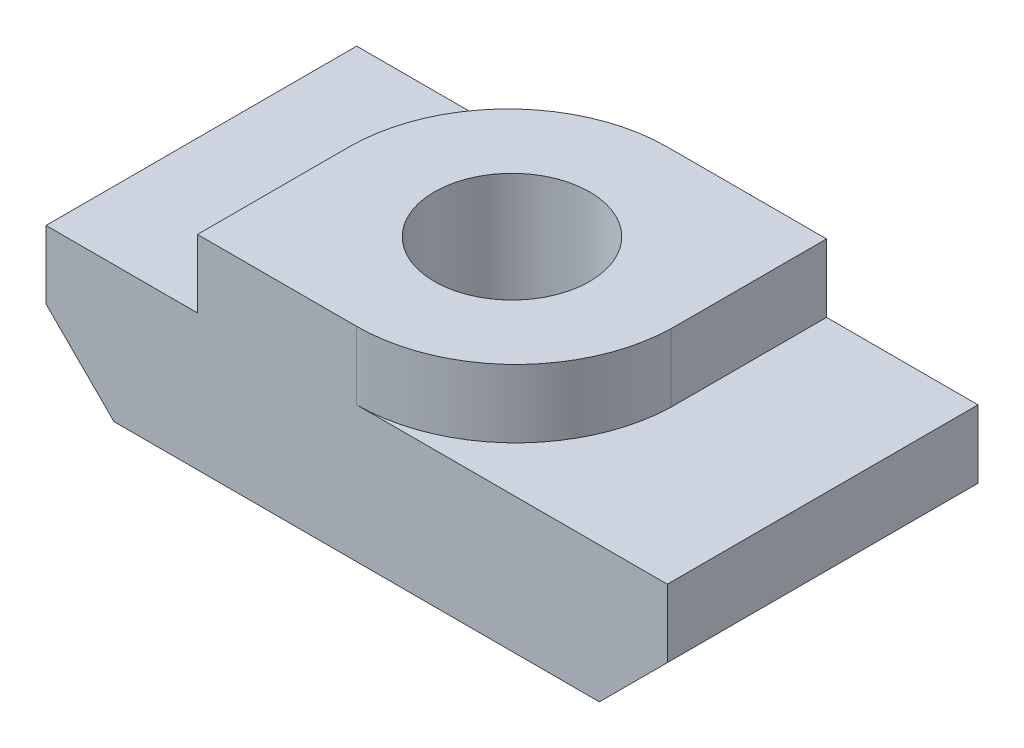
ISO-10303-21;
HEADER;
FILE_DESCRIPTION(('STEP AP214'),'2;1');
FILE_NAME('part.step','',(''),(''),'','','');
FILE_SCHEMA(('AUTOMOTIVE_DESIGN { 1 0 10303 214 1 1 1 1 }'));
ENDSEC;
DATA;
#1=APPLICATION_CONTEXT('core data for automotive mechanical design processes');
#2=APPLICATION_PROTOCOL_DEFINITION('international standard','automotive_design',2000,#1);
#3=PRODUCT_CONTEXT('',#1,'mechanical');
#4=PRODUCT('Part','Part','',(#3));
#5=PRODUCT_RELATED_PRODUCT_CATEGORY('part','',(#4));
#6=PRODUCT_DEFINITION_FORMATION('','',#4);
#7=PRODUCT_DEFINITION_CONTEXT('part definition',#1,'design');
#8=PRODUCT_DEFINITION('design','',#6,#7);
#9=PRODUCT_DEFINITION_SHAPE('','',#8);
#10=(LENGTH_UNIT() NAMED_UNIT(*) SI_UNIT(.MILLI.,.METRE.));
#11=(NAMED_UNIT(*) PLANE_ANGLE_UNIT() SI_UNIT($,.RADIAN.));
#12=(NAMED_UNIT(*) SI_UNIT($,.STERADIAN.) SOLID_ANGLE_UNIT());
#13=UNCERTAINTY_MEASURE_WITH_UNIT(LENGTH_MEASURE(1.E-05),#10,'distance_accuracy_value','');
#14=(GEOMETRIC_REPRESENTATION_CONTEXT(3) GLOBAL_UNCERTAINTY_ASSIGNED_CONTEXT((#13)) GLOBAL_UNIT_ASSIGNED_CONTEXT((#10,
#11,#12)) REPRESENTATION_CONTEXT('',''));
#15=CARTESIAN_POINT('',(0.,0.,0.));
#16=DIRECTION('',(0.,0.,1.));
#17=DIRECTION('',(1.,0.,0.));
#18=AXIS2_PLACEMENT_3D('',#15,#16,#17);
#19=CARTESIAN_POINT('',(4.1,5.25,8.));
#20=DIRECTION('',(0.,-1.,0.));
#21=DIRECTION('',(0.,0.,-1.));
#22=AXIS2_PLACEMENT_3D('',#19,#20,#21);
#23=PLANE('',#22);
#24=CARTESIAN_POINT('',(0.,5.25,4.));
#25=DIRECTION('',(0.,1.,0.));
#26=DIRECTION('',(0.,0.,1.));
#27=AXIS2_PLACEMENT_3D('',#24,#25,#26);
#28=CIRCLE('',#27,2.);
#29=CARTESIAN_POINT('',(0.,5.25,6.));
#30=VERTEX_POINT('',#29);
#31=EDGE_CURVE('E168',#30,#30,#28,.T.);
#32=ORIENTED_EDGE('',*,*,#31,.F.);
#33=EDGE_LOOP('',(#32));
#34=FACE_BOUND('',#33,.T.);
#35=CARTESIAN_POINT('',(0.,5.25,4.1));
#36=DIRECTION('',(0.,1.,0.));
#37=DIRECTION('',(0.,0.,1.));
#38=AXIS2_PLACEMENT_3D('',#35,#36,#37);
#39=CIRCLE('',#38,4.1);
#40=CARTESIAN_POINT('',(0.,5.25,0.));
#41=VERTEX_POINT('',#40);
#42=CARTESIAN_POINT('',(-4.1,5.25,4.1));
#43=VERTEX_POINT('',#42);
#44=EDGE_CURVE('E149',#41,#43,#39,.T.);
#45=ORIENTED_EDGE('',*,*,#44,.T.);
#46=DIRECTION('',(0.,0.,-1.));
#47=VECTOR('',#46,1.);
#48=CARTESIAN_POINT('',(-4.1,5.25,8.));
#49=LINE('',#48,#47);
#50=CARTESIAN_POINT('',(-4.1,5.25,8.));
#51=VERTEX_POINT('',#50);
#52=EDGE_CURVE('E182',#51,#43,#49,.T.);
#53=ORIENTED_EDGE('',*,*,#52,.F.);
#54=DIRECTION('',(-1.,0.,0.));
#55=VECTOR('',#54,1.);
#56=CARTESIAN_POINT('',(4.1,5.25,8.));
#57=LINE('',#56,#55);
#58=CARTESIAN_POINT('',(0.,5.25,8.));
#59=VERTEX_POINT('',#58);
#60=EDGE_CURVE('E198',#59,#51,#57,.T.);
#61=ORIENTED_EDGE('',*,*,#60,.F.);
#62=CARTESIAN_POINT('',(0.,5.25,3.89875));
#63=DIRECTION('',(0.,1.,0.));
#64=DIRECTION('',(0.,0.,1.));
#65=AXIS2_PLACEMENT_3D('',#62,#63,#64);
#66=CIRCLE('',#65,4.10125);
#67=CARTESIAN_POINT('',(4.1,5.25,4.00000000000001));
#68=VERTEX_POINT('',#67);
#69=EDGE_CURVE('E160',#59,#68,#66,.T.);
#70=ORIENTED_EDGE('',*,*,#69,.T.);
#71=DIRECTION('',(0.,0.,-1.));
#72=VECTOR('',#71,1.);
#73=CARTESIAN_POINT('',(4.1,5.25,8.));
#74=LINE('',#73,#72);
#75=CARTESIAN_POINT('',(4.1,5.25,0.));
#76=VERTEX_POINT('',#75);
#77=EDGE_CURVE('E78',#68,#76,#74,.T.);
#78=ORIENTED_EDGE('',*,*,#77,.T.);
#79=DIRECTION('',(-1.,0.,0.));
#80=VECTOR('',#79,1.);
#81=CARTESIAN_POINT('',(4.1,5.25,0.));
#82=LINE('',#81,#80);
#83=EDGE_CURVE('E197',#76,#41,#82,.T.);
#84=ORIENTED_EDGE('',*,*,#83,.T.);
#85=EDGE_LOOP('',(#45,#53,#61,#70,#78,#84));
#86=FACE_BOUND('',#85,.T.);
#87=ADVANCED_FACE('F33',(#34,#86),#23,.F.);
#88=CARTESIAN_POINT('',(-4.1,3.5,8.));
#89=DIRECTION('',(1.,0.,0.));
#90=DIRECTION('',(0.,-1.,0.));
#91=AXIS2_PLACEMENT_3D('',#88,#89,#90);
#92=PLANE('',#91);
#93=DIRECTION('',(0.,1.,0.));
#94=VECTOR('',#93,1.);
#95=CARTESIAN_POINT('',(-4.1,3.5,4.1));
#96=LINE('',#95,#94);
#97=CARTESIAN_POINT('',(-4.1,3.5,4.1));
#98=VERTEX_POINT('',#97);
#99=EDGE_CURVE('E150',#98,#43,#96,.T.);
#100=ORIENTED_EDGE('',*,*,#99,.F.);
#101=DIRECTION('',(0.,0.,-1.));
#102=VECTOR('',#101,1.);
#103=CARTESIAN_POINT('',(-4.1,3.5,8.));
#104=LINE('',#103,#102);
#105=CARTESIAN_POINT('',(-4.1,3.5,8.));
#106=VERTEX_POINT('',#105);
#107=EDGE_CURVE('E156',#106,#98,#104,.T.);
#108=ORIENTED_EDGE('',*,*,#107,.F.);
#109=DIRECTION('',(0.,1.,0.));
#110=VECTOR('',#109,1.);
#111=CARTESIAN_POINT('',(-4.1,3.5,8.));
#112=LINE('',#111,#110);
#113=EDGE_CURVE('E179',#106,#51,#112,.T.);
#114=ORIENTED_EDGE('',*,*,#113,.T.);
#115=ORIENTED_EDGE('',*,*,#52,.T.);
#116=EDGE_LOOP('',(#100,#108,#114,#115));
#117=FACE_BOUND('',#116,.T.);
#118=ADVANCED_FACE('F244',(#117),#92,.F.);
#119=CARTESIAN_POINT('',(4.1,3.5,8.));
#120=DIRECTION('',(-1.,0.,0.));
#121=DIRECTION('',(0.,-1.,0.));
#122=AXIS2_PLACEMENT_3D('',#119,#120,#121);
#123=PLANE('',#122);
#124=DIRECTION('',(0.,1.,0.));
#125=VECTOR('',#124,1.);
#126=CARTESIAN_POINT('',(4.1,3.5,4.00000000000001));
#127=LINE('',#126,#125);
#128=CARTESIAN_POINT('',(4.1,3.5,4.00000000000001));
#129=VERTEX_POINT('',#128);
#130=EDGE_CURVE('E166',#129,#68,#127,.T.);
#131=ORIENTED_EDGE('',*,*,#130,.F.);
#132=DIRECTION('',(0.,0.,-1.));
#133=VECTOR('',#132,1.);
#134=CARTESIAN_POINT('',(4.1,3.5,8.));
#135=LINE('',#134,#133);
#136=CARTESIAN_POINT('',(4.1,3.5,0.));
#137=VERTEX_POINT('',#136);
#138=EDGE_CURVE('E218',#129,#137,#135,.T.);
#139=ORIENTED_EDGE('',*,*,#138,.T.);
#140=DIRECTION('',(0.,1.,0.));
#141=VECTOR('',#140,1.);
#142=CARTESIAN_POINT('',(4.1,3.5,0.));
#143=LINE('',#142,#141);
#144=EDGE_CURVE('E200',#137,#76,#143,.T.);
#145=ORIENTED_EDGE('',*,*,#144,.T.);
#146=ORIENTED_EDGE('',*,*,#77,.F.);
#147=EDGE_LOOP('',(#131,#139,#145,#146));
#148=FACE_BOUND('',#147,.T.);
#149=ADVANCED_FACE('F268',(#148),#123,.F.);
#150=CARTESIAN_POINT('',(0.,0.,8.));
#151=DIRECTION('',(0.,0.,1.));
#152=DIRECTION('',(1.,0.,0.));
#153=AXIS2_PLACEMENT_3D('',#150,#151,#152);
#154=PLANE('',#153);
#155=DIRECTION('',(-1.,0.,0.));
#156=VECTOR('',#155,1.);
#157=CARTESIAN_POINT('',(8.,3.5,8.));
#158=LINE('',#157,#156);
#159=CARTESIAN_POINT('',(8.,3.5,8.));
#160=VERTEX_POINT('',#159);
#161=CARTESIAN_POINT('',(0.,3.5,8.));
#162=VERTEX_POINT('',#161);
#163=EDGE_CURVE('E48',#160,#162,#158,.T.);
#164=ORIENTED_EDGE('',*,*,#163,.T.);
#165=DIRECTION('',(0.,1.,0.));
#166=VECTOR('',#165,1.);
#167=CARTESIAN_POINT('',(0.,3.5,8.));
#168=LINE('',#167,#166);
#169=EDGE_CURVE('E164',#162,#59,#168,.T.);
#170=ORIENTED_EDGE('',*,*,#169,.T.);
#171=ORIENTED_EDGE('',*,*,#60,.T.);
#172=ORIENTED_EDGE('',*,*,#113,.F.);
#173=DIRECTION('',(1.,0.,0.));
#174=VECTOR('',#173,1.);
#175=CARTESIAN_POINT('',(-8.,3.5,8.));
#176=LINE('',#175,#174);
#177=CARTESIAN_POINT('',(-8.,3.5,8.));
#178=VERTEX_POINT('',#177);
#179=EDGE_CURVE('E177',#178,#106,#176,.T.);
#180=ORIENTED_EDGE('',*,*,#179,.F.);
#181=DIRECTION('',(0.,1.,0.));
#182=VECTOR('',#181,1.);
#183=CARTESIAN_POINT('',(-8.,1.75,8.));
#184=LINE('',#183,#182);
#185=CARTESIAN_POINT('',(-8.,1.75,8.));
#186=VERTEX_POINT('',#185);
#187=EDGE_CURVE('E174',#186,#178,#184,.T.);
#188=ORIENTED_EDGE('',*,*,#187,.F.);
#189=DIRECTION('',(-0.707106781186551,0.707106781186544,0.));
#190=VECTOR('',#189,1.);
#191=CARTESIAN_POINT('',(-6.24999999999998,0.,8.));
#192=LINE('',#191,#190);
#193=CARTESIAN_POINT('',(-6.24999999999998,0.,8.));
#194=VERTEX_POINT('',#193);
#195=EDGE_CURVE('E142',#194,#186,#192,.T.);
#196=ORIENTED_EDGE('',*,*,#195,.F.);
#197=DIRECTION('',(1.,0.,0.));
#198=VECTOR('',#197,1.);
#199=CARTESIAN_POINT('',(0.,0.,8.));
#200=LINE('',#199,#198);
#201=CARTESIAN_POINT('',(6.24999999999998,0.,8.));
#202=VERTEX_POINT('',#201);
#203=EDGE_CURVE('E83',#194,#202,#200,.T.);
#204=ORIENTED_EDGE('',*,*,#203,.T.);
#205=DIRECTION('',(0.707106781186551,0.707106781186544,0.));
#206=VECTOR('',#205,1.);
#207=CARTESIAN_POINT('',(6.24999999999998,0.,8.));
#208=LINE('',#207,#206);
#209=CARTESIAN_POINT('',(8.,1.75,8.));
#210=VERTEX_POINT('',#209);
#211=EDGE_CURVE('E202',#202,#210,#208,.T.);
#212=ORIENTED_EDGE('',*,*,#211,.T.);
#213=DIRECTION('',(0.,1.,0.));
#214=VECTOR('',#213,1.);
#215=CARTESIAN_POINT('',(8.,1.75,8.));
#216=LINE('',#215,#214);
#217=EDGE_CURVE('E54',#210,#160,#216,.T.);
#218=ORIENTED_EDGE('',*,*,#217,.T.);
#219=EDGE_LOOP('',(#164,#170,#171,#172,#180,#188,#196,#204,#212,#218));
#220=FACE_BOUND('',#219,.T.);
#221=ADVANCED_FACE('F241',(#220),#154,.T.);
#222=CARTESIAN_POINT('',(0.,0.,8.));
#223=DIRECTION('',(0.,1.,0.));
#224=DIRECTION('',(0.,0.,1.));
#225=AXIS2_PLACEMENT_3D('',#222,#223,#224);
#226=PLANE('',#225);
#227=CARTESIAN_POINT('',(0.,0.,4.));
#228=DIRECTION('',(0.,1.,0.));
#229=DIRECTION('',(0.,0.,1.));
#230=AXIS2_PLACEMENT_3D('',#227,#228,#229);
#231=CIRCLE('',#230,2.);
#232=CARTESIAN_POINT('',(0.,0.,6.));
#233=VERTEX_POINT('',#232);
#234=EDGE_CURVE('E36',#233,#233,#231,.T.);
#235=ORIENTED_EDGE('',*,*,#234,.T.);
#236=EDGE_LOOP('',(#235));
#237=FACE_BOUND('',#236,.T.);
#238=DIRECTION('',(1.,0.,0.));
#239=VECTOR('',#238,1.);
#240=CARTESIAN_POINT('',(0.,0.,0.));
#241=LINE('',#240,#239);
#242=CARTESIAN_POINT('',(-6.24999999999998,0.,0.));
#243=VERTEX_POINT('',#242);
#244=CARTESIAN_POINT('',(6.24999999999998,0.,0.));
#245=VERTEX_POINT('',#244);
#246=EDGE_CURVE('E207',#243,#245,#241,.T.);
#247=ORIENTED_EDGE('',*,*,#246,.T.);
#248=DIRECTION('',(0.,0.,-1.));
#249=VECTOR('',#248,1.);
#250=CARTESIAN_POINT('',(6.24999999999998,0.,8.));
#251=LINE('',#250,#249);
#252=EDGE_CURVE('E11',#202,#245,#251,.T.);
#253=ORIENTED_EDGE('',*,*,#252,.F.);
#254=ORIENTED_EDGE('',*,*,#203,.F.);
#255=DIRECTION('',(0.,0.,-1.));
#256=VECTOR('',#255,1.);
#257=CARTESIAN_POINT('',(-6.24999999999998,0.,8.));
#258=LINE('',#257,#256);
#259=EDGE_CURVE('E194',#194,#243,#258,.T.);
#260=ORIENTED_EDGE('',*,*,#259,.T.);
#261=EDGE_LOOP('',(#247,#253,#254,#260));
#262=FACE_BOUND('',#261,.T.);
#263=ADVANCED_FACE('F253',(#237,#262),#226,.F.);
#264=CARTESIAN_POINT('',(6.24999999999998,0.,8.));
#265=DIRECTION('',(-0.707106781186544,0.707106781186551,0.));
#266=DIRECTION('',(-0.707106781186551,-0.707106781186544,0.));
#267=AXIS2_PLACEMENT_3D('',#264,#265,#266);
#268=PLANE('',#267);
#269=DIRECTION('',(0.707106781186551,0.707106781186544,0.));
#270=VECTOR('',#269,1.);
#271=CARTESIAN_POINT('',(6.24999999999998,0.,0.));
#272=LINE('',#271,#270);
#273=CARTESIAN_POINT('',(8.,1.75,0.));
#274=VERTEX_POINT('',#273);
#275=EDGE_CURVE('E209',#245,#274,#272,.T.);
#276=ORIENTED_EDGE('',*,*,#275,.T.);
#277=DIRECTION('',(0.,0.,-1.));
#278=VECTOR('',#277,1.);
#279=CARTESIAN_POINT('',(8.,1.75,8.));
#280=LINE('',#279,#278);
#281=EDGE_CURVE('E41',#210,#274,#280,.T.);
#282=ORIENTED_EDGE('',*,*,#281,.F.);
#283=ORIENTED_EDGE('',*,*,#211,.F.);
#284=ORIENTED_EDGE('',*,*,#252,.T.);
#285=EDGE_LOOP('',(#276,#282,#283,#284));
#286=FACE_BOUND('',#285,.T.);
#287=ADVANCED_FACE('F254',(#286),#268,.F.);
#288=CARTESIAN_POINT('',(8.,1.75,8.));
#289=DIRECTION('',(-1.,0.,0.));
#290=DIRECTION('',(0.,-1.,0.));
#291=AXIS2_PLACEMENT_3D('',#288,#289,#290);
#292=PLANE('',#291);
#293=DIRECTION('',(0.,1.,0.));
#294=VECTOR('',#293,1.);
#295=CARTESIAN_POINT('',(8.,1.75,0.));
#296=LINE('',#295,#294);
#297=CARTESIAN_POINT('',(8.,3.5,0.));
#298=VERTEX_POINT('',#297);
#299=EDGE_CURVE('E211',#274,#298,#296,.T.);
#300=ORIENTED_EDGE('',*,*,#299,.T.);
#301=DIRECTION('',(0.,0.,-1.));
#302=VECTOR('',#301,1.);
#303=CARTESIAN_POINT('',(8.,3.5,8.));
#304=LINE('',#303,#302);
#305=EDGE_CURVE('E220',#160,#298,#304,.T.);
#306=ORIENTED_EDGE('',*,*,#305,.F.);
#307=ORIENTED_EDGE('',*,*,#217,.F.);
#308=ORIENTED_EDGE('',*,*,#281,.T.);
#309=EDGE_LOOP('',(#300,#306,#307,#308));
#310=FACE_BOUND('',#309,.T.);
#311=ADVANCED_FACE('F227',(#310),#292,.F.);
#312=CARTESIAN_POINT('',(8.,3.5,8.));
#313=DIRECTION('',(0.,-1.,0.));
#314=DIRECTION('',(1.,0.,0.));
#315=AXIS2_PLACEMENT_3D('',#312,#313,#314);
#316=PLANE('',#315);
#317=DIRECTION('',(-1.,0.,0.));
#318=VECTOR('',#317,1.);
#319=CARTESIAN_POINT('',(8.,3.5,0.));
#320=LINE('',#319,#318);
#321=EDGE_CURVE('E213',#298,#137,#320,.T.);
#322=ORIENTED_EDGE('',*,*,#321,.T.);
#323=ORIENTED_EDGE('',*,*,#138,.F.);
#324=CARTESIAN_POINT('',(0.,3.5,3.89875));
#325=DIRECTION('',(0.,1.,0.));
#326=DIRECTION('',(0.,0.,1.));
#327=AXIS2_PLACEMENT_3D('',#324,#325,#326);
#328=CIRCLE('',#327,4.10125);
#329=EDGE_CURVE('E162',#162,#129,#328,.T.);
#330=ORIENTED_EDGE('',*,*,#329,.F.);
#331=ORIENTED_EDGE('',*,*,#163,.F.);
#332=ORIENTED_EDGE('',*,*,#305,.T.);
#333=EDGE_LOOP('',(#322,#323,#330,#331,#332));
#334=FACE_BOUND('',#333,.T.);
#335=ADVANCED_FACE('F235',(#334),#316,.F.);
#336=CARTESIAN_POINT('',(0.,0.,0.));
#337=DIRECTION('',(0.,0.,1.));
#338=DIRECTION('',(1.,0.,0.));
#339=AXIS2_PLACEMENT_3D('',#336,#337,#338);
#340=PLANE('',#339);
#341=DIRECTION('',(1.,0.,0.));
#342=VECTOR('',#341,1.);
#343=CARTESIAN_POINT('',(-8.,3.5,0.));
#344=LINE('',#343,#342);
#345=CARTESIAN_POINT('',(-8.,3.5,0.));
#346=VERTEX_POINT('',#345);
#347=CARTESIAN_POINT('',(0.,3.5,0.));
#348=VERTEX_POINT('',#347);
#349=EDGE_CURVE('E131',#346,#348,#344,.T.);
#350=ORIENTED_EDGE('',*,*,#349,.T.);
#351=DIRECTION('',(0.,1.,0.));
#352=VECTOR('',#351,1.);
#353=CARTESIAN_POINT('',(0.,3.5,0.));
#354=LINE('',#353,#352);
#355=EDGE_CURVE('E135',#348,#41,#354,.T.);
#356=ORIENTED_EDGE('',*,*,#355,.T.);
#357=ORIENTED_EDGE('',*,*,#83,.F.);
#358=ORIENTED_EDGE('',*,*,#144,.F.);
#359=ORIENTED_EDGE('',*,*,#321,.F.);
#360=ORIENTED_EDGE('',*,*,#299,.F.);
#361=ORIENTED_EDGE('',*,*,#275,.F.);
#362=ORIENTED_EDGE('',*,*,#246,.F.);
#363=DIRECTION('',(-0.707106781186551,0.707106781186544,0.));
#364=VECTOR('',#363,1.);
#365=CARTESIAN_POINT('',(-6.24999999999998,0.,0.));
#366=LINE('',#365,#364);
#367=CARTESIAN_POINT('',(-8.,1.75,0.));
#368=VERTEX_POINT('',#367);
#369=EDGE_CURVE('E183',#243,#368,#366,.T.);
#370=ORIENTED_EDGE('',*,*,#369,.T.);
#371=DIRECTION('',(0.,1.,0.));
#372=VECTOR('',#371,1.);
#373=CARTESIAN_POINT('',(-8.,1.75,0.));
#374=LINE('',#373,#372);
#375=EDGE_CURVE('E137',#368,#346,#374,.T.);
#376=ORIENTED_EDGE('',*,*,#375,.T.);
#377=EDGE_LOOP('',(#350,#356,#357,#358,#359,#360,#361,#362,#370,#376));
#378=FACE_BOUND('',#377,.T.);
#379=ADVANCED_FACE('F133',(#378),#340,.F.);
#380=CARTESIAN_POINT('',(-6.24999999999998,0.,8.));
#381=DIRECTION('',(0.707106781186544,0.707106781186551,0.));
#382=DIRECTION('',(0.707106781186551,-0.707106781186544,0.));
#383=AXIS2_PLACEMENT_3D('',#380,#381,#382);
#384=PLANE('',#383);
#385=ORIENTED_EDGE('',*,*,#369,.F.);
#386=ORIENTED_EDGE('',*,*,#259,.F.);
#387=ORIENTED_EDGE('',*,*,#195,.T.);
#388=DIRECTION('',(0.,0.,-1.));
#389=VECTOR('',#388,1.);
#390=CARTESIAN_POINT('',(-8.,1.75,8.));
#391=LINE('',#390,#389);
#392=EDGE_CURVE('E191',#186,#368,#391,.T.);
#393=ORIENTED_EDGE('',*,*,#392,.T.);
#394=EDGE_LOOP('',(#385,#386,#387,#393));
#395=FACE_BOUND('',#394,.T.);
#396=ADVANCED_FACE('F251',(#395),#384,.F.);
#397=CARTESIAN_POINT('',(-8.,1.75,8.));
#398=DIRECTION('',(1.,0.,0.));
#399=DIRECTION('',(0.,-1.,0.));
#400=AXIS2_PLACEMENT_3D('',#397,#398,#399);
#401=PLANE('',#400);
#402=ORIENTED_EDGE('',*,*,#375,.F.);
#403=ORIENTED_EDGE('',*,*,#392,.F.);
#404=ORIENTED_EDGE('',*,*,#187,.T.);
#405=DIRECTION('',(0.,0.,-1.));
#406=VECTOR('',#405,1.);
#407=CARTESIAN_POINT('',(-8.,3.5,8.));
#408=LINE('',#407,#406);
#409=EDGE_CURVE('E189',#178,#346,#408,.T.);
#410=ORIENTED_EDGE('',*,*,#409,.T.);
#411=EDGE_LOOP('',(#402,#403,#404,#410));
#412=FACE_BOUND('',#411,.T.);
#413=ADVANCED_FACE('F247',(#412),#401,.F.);
#414=CARTESIAN_POINT('',(-8.,3.5,8.));
#415=DIRECTION('',(0.,-1.,0.));
#416=DIRECTION('',(-1.,0.,0.));
#417=AXIS2_PLACEMENT_3D('',#414,#415,#416);
#418=PLANE('',#417);
#419=ORIENTED_EDGE('',*,*,#349,.F.);
#420=ORIENTED_EDGE('',*,*,#409,.F.);
#421=ORIENTED_EDGE('',*,*,#179,.T.);
#422=ORIENTED_EDGE('',*,*,#107,.T.);
#423=CARTESIAN_POINT('',(0.,3.5,4.1));
#424=DIRECTION('',(0.,1.,0.));
#425=DIRECTION('',(0.,0.,1.));
#426=AXIS2_PLACEMENT_3D('',#423,#424,#425);
#427=CIRCLE('',#426,4.1);
#428=EDGE_CURVE('E146',#348,#98,#427,.T.);
#429=ORIENTED_EDGE('',*,*,#428,.F.);
#430=EDGE_LOOP('',(#419,#420,#421,#422,#429));
#431=FACE_BOUND('',#430,.T.);
#432=ADVANCED_FACE('F153',(#431),#418,.F.);
#433=CARTESIAN_POINT('',(0.,-2.75,4.));
#434=DIRECTION('',(0.,1.,0.));
#435=DIRECTION('',(0.,0.,1.));
#436=AXIS2_PLACEMENT_3D('',#433,#434,#435);
#437=CYLINDRICAL_SURFACE('',#436,2.);
#438=ORIENTED_EDGE('',*,*,#31,.T.);
#439=EDGE_LOOP('',(#438));
#440=FACE_BOUND('',#439,.T.);
#441=ORIENTED_EDGE('',*,*,#234,.F.);
#442=EDGE_LOOP('',(#441));
#443=FACE_BOUND('',#442,.T.);
#444=ADVANCED_FACE('F272',(#440,#443),#437,.F.);
#445=CARTESIAN_POINT('',(0.,3.5,3.89875));
#446=DIRECTION('',(0.,1.,0.));
#447=DIRECTION('',(0.,0.,1.));
#448=AXIS2_PLACEMENT_3D('',#445,#446,#447);
#449=CYLINDRICAL_SURFACE('',#448,4.10125);
#450=ORIENTED_EDGE('',*,*,#69,.F.);
#451=ORIENTED_EDGE('',*,*,#169,.F.);
#452=ORIENTED_EDGE('',*,*,#329,.T.);
#453=ORIENTED_EDGE('',*,*,#130,.T.);
#454=EDGE_LOOP('',(#450,#451,#452,#453));
#455=FACE_BOUND('',#454,.T.);
#456=ADVANCED_FACE('F239',(#455),#449,.T.);
#457=CARTESIAN_POINT('',(0.,3.5,4.1));
#458=DIRECTION('',(0.,1.,0.));
#459=DIRECTION('',(0.,0.,1.));
#460=AXIS2_PLACEMENT_3D('',#457,#458,#459);
#461=CYLINDRICAL_SURFACE('',#460,4.1);
#462=ORIENTED_EDGE('',*,*,#44,.F.);
#463=ORIENTED_EDGE('',*,*,#355,.F.);
#464=ORIENTED_EDGE('',*,*,#428,.T.);
#465=ORIENTED_EDGE('',*,*,#99,.T.);
#466=EDGE_LOOP('',(#462,#463,#464,#465));
#467=FACE_BOUND('',#466,.T.);
#468=ADVANCED_FACE('F145',(#467),#461,.T.);
#469=CLOSED_SHELL('',(#87,#118,#149,#221,#263,#287,#311,#335,#379,#396,#413,#432,#444,#456,#468));
#470=MANIFOLD_SOLID_BREP('B2',#469);
#471=ADVANCED_BREP_SHAPE_REPRESENTATION('',(#18,#470),#14);
#472=SHAPE_DEFINITION_REPRESENTATION(#9,#471);
ENDSEC;
END-ISO-10303-21;
